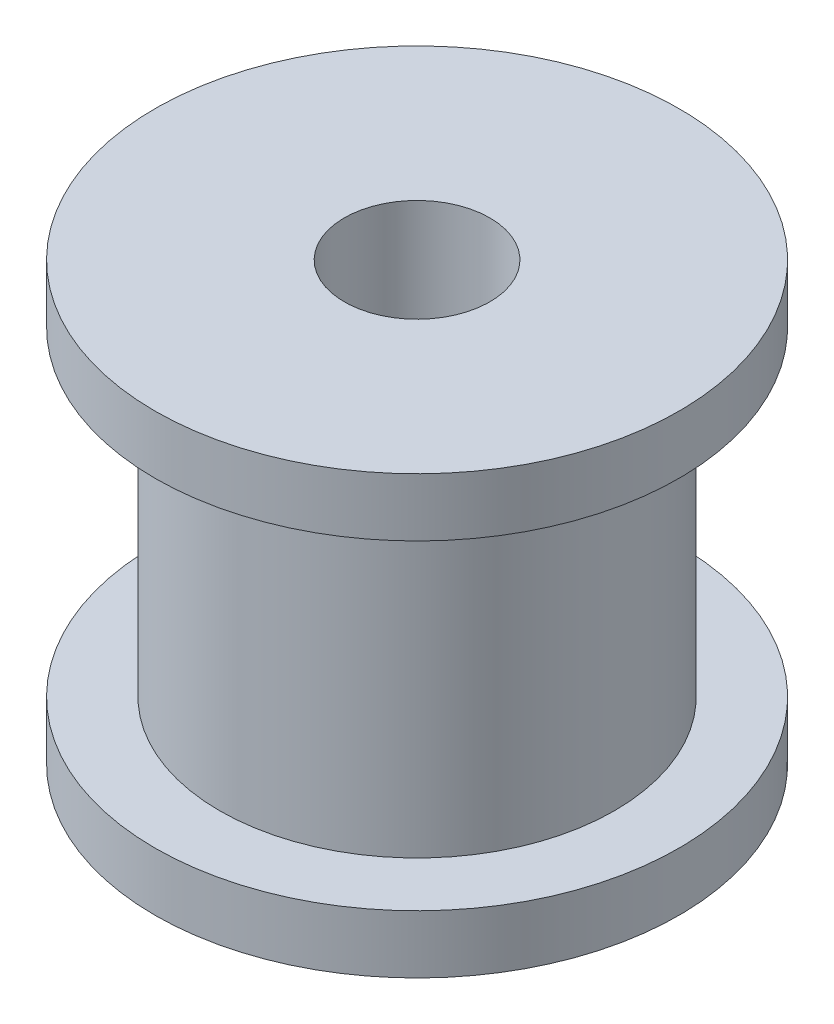
ISO-10303-21;
HEADER;
FILE_DESCRIPTION(('STEP AP214'),'2;1');
FILE_NAME('part.step','',(''),(''),'','','');
FILE_SCHEMA(('AUTOMOTIVE_DESIGN { 1 0 10303 214 1 1 1 1 }'));
ENDSEC;
DATA;
#1=APPLICATION_CONTEXT('core data for automotive mechanical design processes');
#2=APPLICATION_PROTOCOL_DEFINITION('international standard','automotive_design',2000,#1);
#3=PRODUCT_CONTEXT('',#1,'mechanical');
#4=PRODUCT('Part','Part','',(#3));
#5=PRODUCT_RELATED_PRODUCT_CATEGORY('part','',(#4));
#6=PRODUCT_DEFINITION_FORMATION('','',#4);
#7=PRODUCT_DEFINITION_CONTEXT('part definition',#1,'design');
#8=PRODUCT_DEFINITION('design','',#6,#7);
#9=PRODUCT_DEFINITION_SHAPE('','',#8);
#10=(LENGTH_UNIT() NAMED_UNIT(*) SI_UNIT(.MILLI.,.METRE.));
#11=(NAMED_UNIT(*) PLANE_ANGLE_UNIT() SI_UNIT($,.RADIAN.));
#12=(NAMED_UNIT(*) SI_UNIT($,.STERADIAN.) SOLID_ANGLE_UNIT());
#13=UNCERTAINTY_MEASURE_WITH_UNIT(LENGTH_MEASURE(1.E-05),#10,'distance_accuracy_value','');
#14=(GEOMETRIC_REPRESENTATION_CONTEXT(3) GLOBAL_UNCERTAINTY_ASSIGNED_CONTEXT((#13)) GLOBAL_UNIT_ASSIGNED_CONTEXT((#10,
#11,#12)) REPRESENTATION_CONTEXT('',''));
#15=CARTESIAN_POINT('',(0.,0.,0.));
#16=DIRECTION('',(0.,0.,1.));
#17=DIRECTION('',(1.,0.,0.));
#18=AXIS2_PLACEMENT_3D('',#15,#16,#17);
#19=CARTESIAN_POINT('',(0.,2.,0.));
#20=DIRECTION('',(0.,-1.,0.));
#21=DIRECTION('',(0.,0.,-1.));
#22=AXIS2_PLACEMENT_3D('',#19,#20,#21);
#23=CYLINDRICAL_SURFACE('',#22,9.);
#24=CARTESIAN_POINT('',(0.,2.,0.));
#25=DIRECTION('',(0.,1.,0.));
#26=DIRECTION('',(0.,0.,1.));
#27=AXIS2_PLACEMENT_3D('',#24,#25,#26);
#28=CIRCLE('',#27,9.);
#29=CARTESIAN_POINT('',(0.,2.,9.));
#30=VERTEX_POINT('',#29);
#31=EDGE_CURVE('E51',#30,#30,#28,.T.);
#32=ORIENTED_EDGE('',*,*,#31,.F.);
#33=EDGE_LOOP('',(#32));
#34=FACE_BOUND('',#33,.T.);
#35=CARTESIAN_POINT('',(0.,0.,0.));
#36=DIRECTION('',(0.,1.,0.));
#37=DIRECTION('',(0.,0.,1.));
#38=AXIS2_PLACEMENT_3D('',#35,#36,#37);
#39=CIRCLE('',#38,9.);
#40=CARTESIAN_POINT('',(0.,0.,9.));
#41=VERTEX_POINT('',#40);
#42=EDGE_CURVE('E46',#41,#41,#39,.T.);
#43=ORIENTED_EDGE('',*,*,#42,.T.);
#44=EDGE_LOOP('',(#43));
#45=FACE_BOUND('',#44,.T.);
#46=ADVANCED_FACE('F43',(#34,#45),#23,.T.);
#47=CARTESIAN_POINT('',(0.,2.,0.));
#48=DIRECTION('',(0.,1.,0.));
#49=DIRECTION('',(0.,0.,1.));
#50=AXIS2_PLACEMENT_3D('',#47,#48,#49);
#51=PLANE('',#50);
#52=CARTESIAN_POINT('',(0.,2.,0.));
#53=DIRECTION('',(0.,1.,0.));
#54=DIRECTION('',(0.,0.,1.));
#55=AXIS2_PLACEMENT_3D('',#52,#53,#54);
#56=CIRCLE('',#55,6.78);
#57=CARTESIAN_POINT('',(0.,2.,6.78));
#58=VERTEX_POINT('',#57);
#59=EDGE_CURVE('E10',#58,#58,#56,.T.);
#60=ORIENTED_EDGE('',*,*,#59,.F.);
#61=EDGE_LOOP('',(#60));
#62=FACE_BOUND('',#61,.T.);
#63=ORIENTED_EDGE('',*,*,#31,.T.);
#64=EDGE_LOOP('',(#63));
#65=FACE_BOUND('',#64,.T.);
#66=ADVANCED_FACE('F93',(#62,#65),#51,.T.);
#67=CARTESIAN_POINT('',(0.,0.,0.));
#68=DIRECTION('',(0.,1.,0.));
#69=DIRECTION('',(0.,0.,1.));
#70=AXIS2_PLACEMENT_3D('',#67,#68,#69);
#71=PLANE('',#70);
#72=CARTESIAN_POINT('',(0.,0.,0.));
#73=DIRECTION('',(0.,-1.,0.));
#74=DIRECTION('',(0.,0.,-1.));
#75=AXIS2_PLACEMENT_3D('',#72,#73,#74);
#76=CIRCLE('',#75,2.5);
#77=CARTESIAN_POINT('',(0.,0.,-2.5));
#78=VERTEX_POINT('',#77);
#79=EDGE_CURVE('E71',#78,#78,#76,.T.);
#80=ORIENTED_EDGE('',*,*,#79,.F.);
#81=EDGE_LOOP('',(#80));
#82=FACE_BOUND('',#81,.T.);
#83=ORIENTED_EDGE('',*,*,#42,.F.);
#84=EDGE_LOOP('',(#83));
#85=FACE_BOUND('',#84,.T.);
#86=ADVANCED_FACE('F89',(#82,#85),#71,.F.);
#87=CARTESIAN_POINT('',(0.,13.,0.));
#88=DIRECTION('',(0.,-1.,0.));
#89=DIRECTION('',(0.,0.,-1.));
#90=AXIS2_PLACEMENT_3D('',#87,#88,#89);
#91=CYLINDRICAL_SURFACE('',#90,6.78);
#92=CARTESIAN_POINT('',(0.,13.,0.));
#93=DIRECTION('',(0.,1.,0.));
#94=DIRECTION('',(0.,0.,1.));
#95=AXIS2_PLACEMENT_3D('',#92,#93,#94);
#96=CIRCLE('',#95,6.78);
#97=CARTESIAN_POINT('',(0.,13.,6.78));
#98=VERTEX_POINT('',#97);
#99=EDGE_CURVE('E58',#98,#98,#96,.T.);
#100=ORIENTED_EDGE('',*,*,#99,.F.);
#101=EDGE_LOOP('',(#100));
#102=FACE_BOUND('',#101,.T.);
#103=ORIENTED_EDGE('',*,*,#59,.T.);
#104=EDGE_LOOP('',(#103));
#105=FACE_BOUND('',#104,.T.);
#106=ADVANCED_FACE('F92',(#102,#105),#91,.T.);
#107=CARTESIAN_POINT('',(0.,15.,0.));
#108=DIRECTION('',(0.,-1.,0.));
#109=DIRECTION('',(0.,0.,-1.));
#110=AXIS2_PLACEMENT_3D('',#107,#108,#109);
#111=CYLINDRICAL_SURFACE('',#110,9.);
#112=CARTESIAN_POINT('',(0.,15.,0.));
#113=DIRECTION('',(0.,1.,0.));
#114=DIRECTION('',(0.,0.,1.));
#115=AXIS2_PLACEMENT_3D('',#112,#113,#114);
#116=CIRCLE('',#115,9.);
#117=CARTESIAN_POINT('',(0.,15.,9.));
#118=VERTEX_POINT('',#117);
#119=EDGE_CURVE('E62',#118,#118,#116,.T.);
#120=ORIENTED_EDGE('',*,*,#119,.F.);
#121=EDGE_LOOP('',(#120));
#122=FACE_BOUND('',#121,.T.);
#123=CARTESIAN_POINT('',(0.,13.,0.));
#124=DIRECTION('',(0.,1.,0.));
#125=DIRECTION('',(0.,0.,1.));
#126=AXIS2_PLACEMENT_3D('',#123,#124,#125);
#127=CIRCLE('',#126,9.);
#128=CARTESIAN_POINT('',(0.,13.,9.));
#129=VERTEX_POINT('',#128);
#130=EDGE_CURVE('E63',#129,#129,#127,.T.);
#131=ORIENTED_EDGE('',*,*,#130,.T.);
#132=EDGE_LOOP('',(#131));
#133=FACE_BOUND('',#132,.T.);
#134=ADVANCED_FACE('F112',(#122,#133),#111,.T.);
#135=CARTESIAN_POINT('',(0.,15.,0.));
#136=DIRECTION('',(0.,1.,0.));
#137=DIRECTION('',(0.,0.,1.));
#138=AXIS2_PLACEMENT_3D('',#135,#136,#137);
#139=PLANE('',#138);
#140=CARTESIAN_POINT('',(0.,15.,0.));
#141=DIRECTION('',(0.,-1.,0.));
#142=DIRECTION('',(0.,0.,-1.));
#143=AXIS2_PLACEMENT_3D('',#140,#141,#142);
#144=CIRCLE('',#143,2.5);
#145=CARTESIAN_POINT('',(0.,15.,-2.5));
#146=VERTEX_POINT('',#145);
#147=EDGE_CURVE('E67',#146,#146,#144,.T.);
#148=ORIENTED_EDGE('',*,*,#147,.T.);
#149=EDGE_LOOP('',(#148));
#150=FACE_BOUND('',#149,.T.);
#151=ORIENTED_EDGE('',*,*,#119,.T.);
#152=EDGE_LOOP('',(#151));
#153=FACE_BOUND('',#152,.T.);
#154=ADVANCED_FACE('F79',(#150,#153),#139,.T.);
#155=CARTESIAN_POINT('',(0.,13.,0.));
#156=DIRECTION('',(0.,1.,0.));
#157=DIRECTION('',(0.,0.,1.));
#158=AXIS2_PLACEMENT_3D('',#155,#156,#157);
#159=PLANE('',#158);
#160=ORIENTED_EDGE('',*,*,#99,.T.);
#161=EDGE_LOOP('',(#160));
#162=FACE_BOUND('',#161,.T.);
#163=ORIENTED_EDGE('',*,*,#130,.F.);
#164=EDGE_LOOP('',(#163));
#165=FACE_BOUND('',#164,.T.);
#166=ADVANCED_FACE('F85',(#162,#165),#159,.F.);
#167=CARTESIAN_POINT('',(0.,15.,0.));
#168=DIRECTION('',(0.,-1.,0.));
#169=DIRECTION('',(0.,0.,-1.));
#170=AXIS2_PLACEMENT_3D('',#167,#168,#169);
#171=CYLINDRICAL_SURFACE('',#170,2.5);
#172=ORIENTED_EDGE('',*,*,#147,.F.);
#173=EDGE_LOOP('',(#172));
#174=FACE_BOUND('',#173,.T.);
#175=ORIENTED_EDGE('',*,*,#79,.T.);
#176=EDGE_LOOP('',(#175));
#177=FACE_BOUND('',#176,.T.);
#178=ADVANCED_FACE('F82',(#174,#177),#171,.F.);
#179=CLOSED_SHELL('',(#46,#66,#86,#106,#134,#154,#166,#178));
#180=MANIFOLD_SOLID_BREP('B2',#179);
#181=ADVANCED_BREP_SHAPE_REPRESENTATION('',(#18,#180),#14);
#182=SHAPE_DEFINITION_REPRESENTATION(#9,#181);
ENDSEC;
END-ISO-10303-21;
